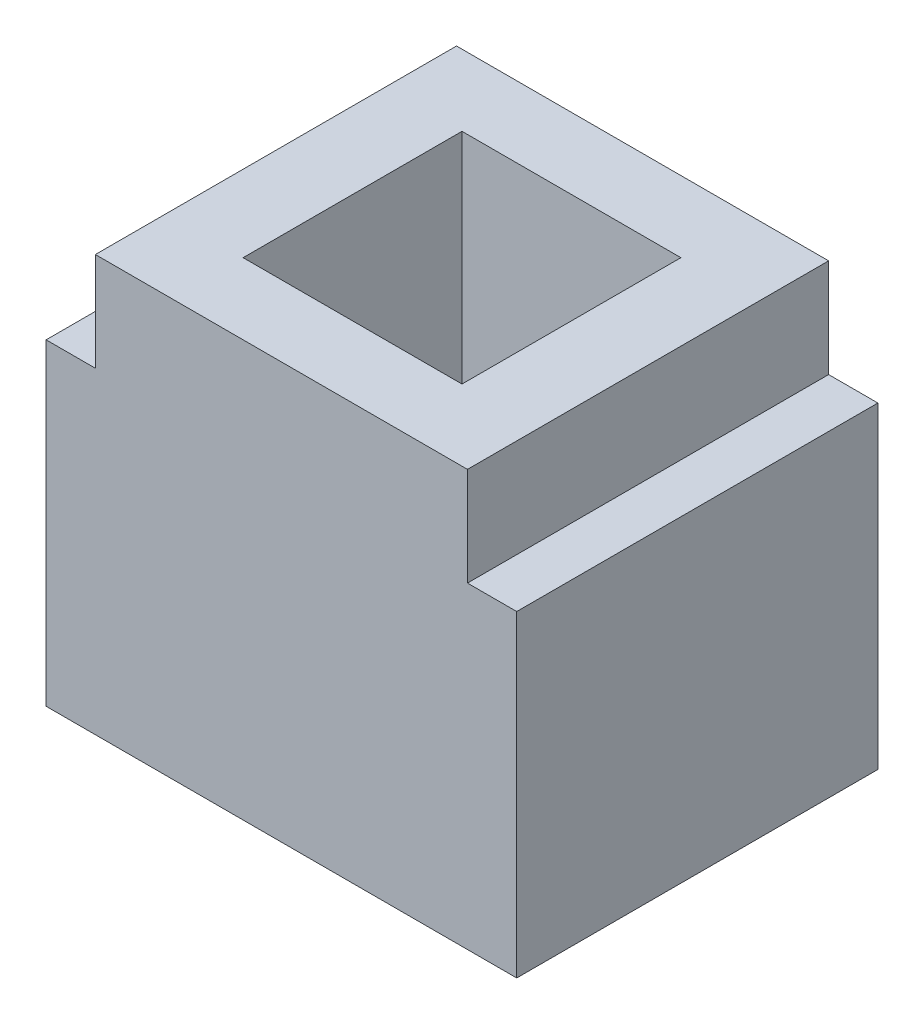
ISO-10303-21;
HEADER;
FILE_DESCRIPTION(('STEP AP214'),'2;1');
FILE_NAME('part.step','',(''),(''),'','','');
FILE_SCHEMA(('AUTOMOTIVE_DESIGN { 1 0 10303 214 1 1 1 1 }'));
ENDSEC;
DATA;
#1=APPLICATION_CONTEXT('core data for automotive mechanical design processes');
#2=APPLICATION_PROTOCOL_DEFINITION('international standard','automotive_design',2000,#1);
#3=PRODUCT_CONTEXT('',#1,'mechanical');
#4=PRODUCT('Part','Part','',(#3));
#5=PRODUCT_RELATED_PRODUCT_CATEGORY('part','',(#4));
#6=PRODUCT_DEFINITION_FORMATION('','',#4);
#7=PRODUCT_DEFINITION_CONTEXT('part definition',#1,'design');
#8=PRODUCT_DEFINITION('design','',#6,#7);
#9=PRODUCT_DEFINITION_SHAPE('','',#8);
#10=(LENGTH_UNIT() NAMED_UNIT(*) SI_UNIT(.MILLI.,.METRE.));
#11=(NAMED_UNIT(*) PLANE_ANGLE_UNIT() SI_UNIT($,.RADIAN.));
#12=(NAMED_UNIT(*) SI_UNIT($,.STERADIAN.) SOLID_ANGLE_UNIT());
#13=UNCERTAINTY_MEASURE_WITH_UNIT(LENGTH_MEASURE(1.E-05),#10,'distance_accuracy_value','');
#14=(GEOMETRIC_REPRESENTATION_CONTEXT(3) GLOBAL_UNCERTAINTY_ASSIGNED_CONTEXT((#13)) GLOBAL_UNIT_ASSIGNED_CONTEXT((#10,
#11,#12)) REPRESENTATION_CONTEXT('',''));
#15=CARTESIAN_POINT('',(0.,0.,0.));
#16=DIRECTION('',(0.,0.,1.));
#17=DIRECTION('',(1.,0.,0.));
#18=AXIS2_PLACEMENT_3D('',#15,#16,#17);
#19=CARTESIAN_POINT('',(43.,-29.,-66.));
#20=DIRECTION('',(1.,0.,0.));
#21=DIRECTION('',(0.,0.,-1.));
#22=AXIS2_PLACEMENT_3D('',#19,#20,#21);
#23=PLANE('',#22);
#24=DIRECTION('',(0.,1.,0.));
#25=VECTOR('',#24,1.);
#26=CARTESIAN_POINT('',(43.,-29.,0.));
#27=LINE('',#26,#25);
#28=CARTESIAN_POINT('',(43.,-29.,0.));
#29=VERTEX_POINT('',#28);
#30=CARTESIAN_POINT('',(43.,29.,0.));
#31=VERTEX_POINT('',#30);
#32=EDGE_CURVE('E149',#29,#31,#27,.T.);
#33=ORIENTED_EDGE('',*,*,#32,.F.);
#34=DIRECTION('',(0.,0.,1.));
#35=VECTOR('',#34,1.);
#36=CARTESIAN_POINT('',(43.,-29.,-66.));
#37=LINE('',#36,#35);
#38=CARTESIAN_POINT('',(43.,-29.,-66.));
#39=VERTEX_POINT('',#38);
#40=EDGE_CURVE('E11',#39,#29,#37,.T.);
#41=ORIENTED_EDGE('',*,*,#40,.F.);
#42=DIRECTION('',(0.,1.,0.));
#43=VECTOR('',#42,1.);
#44=CARTESIAN_POINT('',(43.,-29.,-66.));
#45=LINE('',#44,#43);
#46=CARTESIAN_POINT('',(43.,29.,-66.));
#47=VERTEX_POINT('',#46);
#48=EDGE_CURVE('E170',#39,#47,#45,.T.);
#49=ORIENTED_EDGE('',*,*,#48,.T.);
#50=DIRECTION('',(0.,0.,1.));
#51=VECTOR('',#50,1.);
#52=CARTESIAN_POINT('',(43.,29.,-66.));
#53=LINE('',#52,#51);
#54=EDGE_CURVE('E42',#47,#31,#53,.T.);
#55=ORIENTED_EDGE('',*,*,#54,.T.);
#56=EDGE_LOOP('',(#33,#41,#49,#55));
#57=FACE_BOUND('',#56,.T.);
#58=ADVANCED_FACE('F39',(#57),#23,.T.);
#59=CARTESIAN_POINT('',(-43.,-29.,-66.));
#60=DIRECTION('',(0.,-1.,0.));
#61=DIRECTION('',(0.,0.,-1.));
#62=AXIS2_PLACEMENT_3D('',#59,#60,#61);
#63=PLANE('',#62);
#64=DIRECTION('',(1.,0.,0.));
#65=VECTOR('',#64,1.);
#66=CARTESIAN_POINT('',(-43.,-29.,0.));
#67=LINE('',#66,#65);
#68=CARTESIAN_POINT('',(-43.,-29.,0.));
#69=VERTEX_POINT('',#68);
#70=EDGE_CURVE('E168',#69,#29,#67,.T.);
#71=ORIENTED_EDGE('',*,*,#70,.F.);
#72=DIRECTION('',(0.,0.,1.));
#73=VECTOR('',#72,1.);
#74=CARTESIAN_POINT('',(-43.,-29.,-66.));
#75=LINE('',#74,#73);
#76=CARTESIAN_POINT('',(-43.,-29.,-66.));
#77=VERTEX_POINT('',#76);
#78=EDGE_CURVE('E47',#77,#69,#75,.T.);
#79=ORIENTED_EDGE('',*,*,#78,.F.);
#80=DIRECTION('',(1.,0.,0.));
#81=VECTOR('',#80,1.);
#82=CARTESIAN_POINT('',(-43.,-29.,-66.));
#83=LINE('',#82,#81);
#84=EDGE_CURVE('E139',#77,#39,#83,.T.);
#85=ORIENTED_EDGE('',*,*,#84,.T.);
#86=ORIENTED_EDGE('',*,*,#40,.T.);
#87=EDGE_LOOP('',(#71,#79,#85,#86));
#88=FACE_BOUND('',#87,.T.);
#89=ADVANCED_FACE('F182',(#88),#63,.T.);
#90=CARTESIAN_POINT('',(-43.,29.,-66.));
#91=DIRECTION('',(-1.,0.,0.));
#92=DIRECTION('',(0.,0.,1.));
#93=AXIS2_PLACEMENT_3D('',#90,#91,#92);
#94=PLANE('',#93);
#95=DIRECTION('',(0.,-1.,0.));
#96=VECTOR('',#95,1.);
#97=CARTESIAN_POINT('',(-43.,29.,0.));
#98=LINE('',#97,#96);
#99=CARTESIAN_POINT('',(-43.,29.,0.));
#100=VERTEX_POINT('',#99);
#101=EDGE_CURVE('E126',#100,#69,#98,.T.);
#102=ORIENTED_EDGE('',*,*,#101,.F.);
#103=DIRECTION('',(0.,0.,1.));
#104=VECTOR('',#103,1.);
#105=CARTESIAN_POINT('',(-43.,29.,-66.));
#106=LINE('',#105,#104);
#107=CARTESIAN_POINT('',(-43.,29.,-66.));
#108=VERTEX_POINT('',#107);
#109=EDGE_CURVE('E120',#108,#100,#106,.T.);
#110=ORIENTED_EDGE('',*,*,#109,.F.);
#111=DIRECTION('',(0.,-1.,0.));
#112=VECTOR('',#111,1.);
#113=CARTESIAN_POINT('',(-43.,29.,-66.));
#114=LINE('',#113,#112);
#115=EDGE_CURVE('E123',#108,#77,#114,.T.);
#116=ORIENTED_EDGE('',*,*,#115,.T.);
#117=ORIENTED_EDGE('',*,*,#78,.T.);
#118=EDGE_LOOP('',(#102,#110,#116,#117));
#119=FACE_BOUND('',#118,.T.);
#120=ADVANCED_FACE('F122',(#119),#94,.T.);
#121=CARTESIAN_POINT('',(-34.,29.,-66.));
#122=DIRECTION('',(0.,1.,0.));
#123=DIRECTION('',(-1.,0.,0.));
#124=AXIS2_PLACEMENT_3D('',#121,#122,#123);
#125=PLANE('',#124);
#126=DIRECTION('',(-1.,0.,0.));
#127=VECTOR('',#126,1.);
#128=CARTESIAN_POINT('',(-34.,29.,0.));
#129=LINE('',#128,#127);
#130=CARTESIAN_POINT('',(-34.,29.,0.));
#131=VERTEX_POINT('',#130);
#132=EDGE_CURVE('E165',#131,#100,#129,.T.);
#133=ORIENTED_EDGE('',*,*,#132,.F.);
#134=DIRECTION('',(0.,0.,1.));
#135=VECTOR('',#134,1.);
#136=CARTESIAN_POINT('',(-34.,29.,-66.));
#137=LINE('',#136,#135);
#138=CARTESIAN_POINT('',(-34.,29.,-66.));
#139=VERTEX_POINT('',#138);
#140=EDGE_CURVE('E131',#139,#131,#137,.T.);
#141=ORIENTED_EDGE('',*,*,#140,.F.);
#142=DIRECTION('',(-1.,0.,0.));
#143=VECTOR('',#142,1.);
#144=CARTESIAN_POINT('',(-34.,29.,-66.));
#145=LINE('',#144,#143);
#146=EDGE_CURVE('E137',#139,#108,#145,.T.);
#147=ORIENTED_EDGE('',*,*,#146,.T.);
#148=ORIENTED_EDGE('',*,*,#109,.T.);
#149=EDGE_LOOP('',(#133,#141,#147,#148));
#150=FACE_BOUND('',#149,.T.);
#151=ADVANCED_FACE('F141',(#150),#125,.T.);
#152=CARTESIAN_POINT('',(-34.,47.,-66.));
#153=DIRECTION('',(-1.,0.,0.));
#154=DIRECTION('',(0.,0.,1.));
#155=AXIS2_PLACEMENT_3D('',#152,#153,#154);
#156=PLANE('',#155);
#157=DIRECTION('',(0.,-1.,0.));
#158=VECTOR('',#157,1.);
#159=CARTESIAN_POINT('',(-34.,47.,0.));
#160=LINE('',#159,#158);
#161=CARTESIAN_POINT('',(-34.,47.,0.));
#162=VERTEX_POINT('',#161);
#163=EDGE_CURVE('E162',#162,#131,#160,.T.);
#164=ORIENTED_EDGE('',*,*,#163,.F.);
#165=DIRECTION('',(0.,0.,1.));
#166=VECTOR('',#165,1.);
#167=CARTESIAN_POINT('',(-34.,47.,-66.));
#168=LINE('',#167,#166);
#169=CARTESIAN_POINT('',(-34.,47.,-66.));
#170=VERTEX_POINT('',#169);
#171=EDGE_CURVE('E174',#170,#162,#168,.T.);
#172=ORIENTED_EDGE('',*,*,#171,.F.);
#173=DIRECTION('',(0.,-1.,0.));
#174=VECTOR('',#173,1.);
#175=CARTESIAN_POINT('',(-34.,47.,-66.));
#176=LINE('',#175,#174);
#177=EDGE_CURVE('E142',#170,#139,#176,.T.);
#178=ORIENTED_EDGE('',*,*,#177,.T.);
#179=ORIENTED_EDGE('',*,*,#140,.T.);
#180=EDGE_LOOP('',(#164,#172,#178,#179));
#181=FACE_BOUND('',#180,.T.);
#182=ADVANCED_FACE('F195',(#181),#156,.T.);
#183=CARTESIAN_POINT('',(34.,47.,-66.));
#184=DIRECTION('',(0.,1.,0.));
#185=DIRECTION('',(0.,0.,1.));
#186=AXIS2_PLACEMENT_3D('',#183,#184,#185);
#187=PLANE('',#186);
#188=DIRECTION('',(0.,0.,1.));
#189=VECTOR('',#188,1.);
#190=CARTESIAN_POINT('',(-20.,47.,-53.));
#191=LINE('',#190,#189);
#192=CARTESIAN_POINT('',(-20.,47.,-53.));
#193=VERTEX_POINT('',#192);
#194=CARTESIAN_POINT('',(-20.,47.,-13.));
#195=VERTEX_POINT('',#194);
#196=EDGE_CURVE('E55',#193,#195,#191,.T.);
#197=ORIENTED_EDGE('',*,*,#196,.F.);
#198=DIRECTION('',(-1.,0.,0.));
#199=VECTOR('',#198,1.);
#200=CARTESIAN_POINT('',(-20.,47.,-53.));
#201=LINE('',#200,#199);
#202=CARTESIAN_POINT('',(20.,47.,-53.));
#203=VERTEX_POINT('',#202);
#204=EDGE_CURVE('E247',#203,#193,#201,.T.);
#205=ORIENTED_EDGE('',*,*,#204,.F.);
#206=DIRECTION('',(0.,0.,-1.));
#207=VECTOR('',#206,1.);
#208=CARTESIAN_POINT('',(20.,47.,-53.));
#209=LINE('',#208,#207);
#210=CARTESIAN_POINT('',(20.,47.,-13.));
#211=VERTEX_POINT('',#210);
#212=EDGE_CURVE('E252',#211,#203,#209,.T.);
#213=ORIENTED_EDGE('',*,*,#212,.F.);
#214=DIRECTION('',(1.,0.,0.));
#215=VECTOR('',#214,1.);
#216=CARTESIAN_POINT('',(-20.,47.,-13.));
#217=LINE('',#216,#215);
#218=EDGE_CURVE('E259',#195,#211,#217,.T.);
#219=ORIENTED_EDGE('',*,*,#218,.F.);
#220=EDGE_LOOP('',(#197,#205,#213,#219));
#221=FACE_BOUND('',#220,.T.);
#222=DIRECTION('',(-1.,0.,0.));
#223=VECTOR('',#222,1.);
#224=CARTESIAN_POINT('',(34.,47.,0.));
#225=LINE('',#224,#223);
#226=CARTESIAN_POINT('',(34.,47.,0.));
#227=VERTEX_POINT('',#226);
#228=EDGE_CURVE('E159',#227,#162,#225,.T.);
#229=ORIENTED_EDGE('',*,*,#228,.F.);
#230=DIRECTION('',(0.,0.,1.));
#231=VECTOR('',#230,1.);
#232=CARTESIAN_POINT('',(34.,47.,-66.));
#233=LINE('',#232,#231);
#234=CARTESIAN_POINT('',(34.,47.,-66.));
#235=VERTEX_POINT('',#234);
#236=EDGE_CURVE('E176',#235,#227,#233,.T.);
#237=ORIENTED_EDGE('',*,*,#236,.F.);
#238=DIRECTION('',(-1.,0.,0.));
#239=VECTOR('',#238,1.);
#240=CARTESIAN_POINT('',(34.,47.,-66.));
#241=LINE('',#240,#239);
#242=EDGE_CURVE('E144',#235,#170,#241,.T.);
#243=ORIENTED_EDGE('',*,*,#242,.T.);
#244=ORIENTED_EDGE('',*,*,#171,.T.);
#245=EDGE_LOOP('',(#229,#237,#243,#244));
#246=FACE_BOUND('',#245,.T.);
#247=ADVANCED_FACE('F198',(#221,#246),#187,.T.);
#248=CARTESIAN_POINT('',(34.,29.,-66.));
#249=DIRECTION('',(1.,0.,0.));
#250=DIRECTION('',(0.,0.,-1.));
#251=AXIS2_PLACEMENT_3D('',#248,#249,#250);
#252=PLANE('',#251);
#253=DIRECTION('',(0.,1.,0.));
#254=VECTOR('',#253,1.);
#255=CARTESIAN_POINT('',(34.,29.,0.));
#256=LINE('',#255,#254);
#257=CARTESIAN_POINT('',(34.,29.,0.));
#258=VERTEX_POINT('',#257);
#259=EDGE_CURVE('E156',#258,#227,#256,.T.);
#260=ORIENTED_EDGE('',*,*,#259,.F.);
#261=DIRECTION('',(0.,0.,1.));
#262=VECTOR('',#261,1.);
#263=CARTESIAN_POINT('',(34.,29.,-66.));
#264=LINE('',#263,#262);
#265=CARTESIAN_POINT('',(34.,29.,-66.));
#266=VERTEX_POINT('',#265);
#267=EDGE_CURVE('E177',#266,#258,#264,.T.);
#268=ORIENTED_EDGE('',*,*,#267,.F.);
#269=DIRECTION('',(0.,1.,0.));
#270=VECTOR('',#269,1.);
#271=CARTESIAN_POINT('',(34.,29.,-66.));
#272=LINE('',#271,#270);
#273=EDGE_CURVE('E275',#266,#235,#272,.T.);
#274=ORIENTED_EDGE('',*,*,#273,.T.);
#275=ORIENTED_EDGE('',*,*,#236,.T.);
#276=EDGE_LOOP('',(#260,#268,#274,#275));
#277=FACE_BOUND('',#276,.T.);
#278=ADVANCED_FACE('F202',(#277),#252,.T.);
#279=CARTESIAN_POINT('',(43.,29.,-66.));
#280=DIRECTION('',(0.,1.,0.));
#281=DIRECTION('',(-1.,0.,0.));
#282=AXIS2_PLACEMENT_3D('',#279,#280,#281);
#283=PLANE('',#282);
#284=DIRECTION('',(-1.,0.,0.));
#285=VECTOR('',#284,1.);
#286=CARTESIAN_POINT('',(43.,29.,0.));
#287=LINE('',#286,#285);
#288=EDGE_CURVE('E152',#31,#258,#287,.T.);
#289=ORIENTED_EDGE('',*,*,#288,.F.);
#290=ORIENTED_EDGE('',*,*,#54,.F.);
#291=DIRECTION('',(-1.,0.,0.));
#292=VECTOR('',#291,1.);
#293=CARTESIAN_POINT('',(43.,29.,-66.));
#294=LINE('',#293,#292);
#295=EDGE_CURVE('E273',#47,#266,#294,.T.);
#296=ORIENTED_EDGE('',*,*,#295,.T.);
#297=ORIENTED_EDGE('',*,*,#267,.T.);
#298=EDGE_LOOP('',(#289,#290,#296,#297));
#299=FACE_BOUND('',#298,.T.);
#300=ADVANCED_FACE('F179',(#299),#283,.T.);
#301=CARTESIAN_POINT('',(0.,0.,-66.));
#302=DIRECTION('',(0.,0.,1.));
#303=DIRECTION('',(1.,0.,0.));
#304=AXIS2_PLACEMENT_3D('',#301,#302,#303);
#305=PLANE('',#304);
#306=ORIENTED_EDGE('',*,*,#48,.F.);
#307=ORIENTED_EDGE('',*,*,#84,.F.);
#308=ORIENTED_EDGE('',*,*,#115,.F.);
#309=ORIENTED_EDGE('',*,*,#146,.F.);
#310=ORIENTED_EDGE('',*,*,#177,.F.);
#311=ORIENTED_EDGE('',*,*,#242,.F.);
#312=ORIENTED_EDGE('',*,*,#273,.F.);
#313=ORIENTED_EDGE('',*,*,#295,.F.);
#314=EDGE_LOOP('',(#306,#307,#308,#309,#310,#311,#312,#313));
#315=FACE_BOUND('',#314,.T.);
#316=ADVANCED_FACE('F135',(#315),#305,.F.);
#317=CARTESIAN_POINT('',(0.,0.,0.));
#318=DIRECTION('',(0.,0.,1.));
#319=DIRECTION('',(1.,0.,0.));
#320=AXIS2_PLACEMENT_3D('',#317,#318,#319);
#321=PLANE('',#320);
#322=ORIENTED_EDGE('',*,*,#32,.T.);
#323=ORIENTED_EDGE('',*,*,#288,.T.);
#324=ORIENTED_EDGE('',*,*,#259,.T.);
#325=ORIENTED_EDGE('',*,*,#228,.T.);
#326=ORIENTED_EDGE('',*,*,#163,.T.);
#327=ORIENTED_EDGE('',*,*,#132,.T.);
#328=ORIENTED_EDGE('',*,*,#101,.T.);
#329=ORIENTED_EDGE('',*,*,#70,.T.);
#330=EDGE_LOOP('',(#322,#323,#324,#325,#326,#327,#328,#329));
#331=FACE_BOUND('',#330,.T.);
#332=ADVANCED_FACE('F181',(#331),#321,.T.);
#333=CARTESIAN_POINT('',(-20.,-3.00000000000001,-53.));
#334=DIRECTION('',(-1.,0.,0.));
#335=DIRECTION('',(0.,0.,1.));
#336=AXIS2_PLACEMENT_3D('',#333,#334,#335);
#337=PLANE('',#336);
#338=ORIENTED_EDGE('',*,*,#196,.T.);
#339=DIRECTION('',(0.,1.,0.));
#340=VECTOR('',#339,1.);
#341=CARTESIAN_POINT('',(-20.,-3.00000000000001,-13.));
#342=LINE('',#341,#340);
#343=CARTESIAN_POINT('',(-20.,-3.00000000000001,-13.));
#344=VERTEX_POINT('',#343);
#345=EDGE_CURVE('E257',#344,#195,#342,.T.);
#346=ORIENTED_EDGE('',*,*,#345,.F.);
#347=DIRECTION('',(0.,0.,1.));
#348=VECTOR('',#347,1.);
#349=CARTESIAN_POINT('',(-20.,-3.00000000000001,-53.));
#350=LINE('',#349,#348);
#351=CARTESIAN_POINT('',(-20.,-3.00000000000001,-53.));
#352=VERTEX_POINT('',#351);
#353=EDGE_CURVE('E239',#352,#344,#350,.T.);
#354=ORIENTED_EDGE('',*,*,#353,.F.);
#355=DIRECTION('',(0.,1.,0.));
#356=VECTOR('',#355,1.);
#357=CARTESIAN_POINT('',(-20.,-3.00000000000001,-53.));
#358=LINE('',#357,#356);
#359=EDGE_CURVE('E153',#352,#193,#358,.T.);
#360=ORIENTED_EDGE('',*,*,#359,.T.);
#361=EDGE_LOOP('',(#338,#346,#354,#360));
#362=FACE_BOUND('',#361,.T.);
#363=ADVANCED_FACE('F213',(#362),#337,.F.);
#364=CARTESIAN_POINT('',(-20.,-3.00000000000001,-53.));
#365=DIRECTION('',(0.,0.,-1.));
#366=DIRECTION('',(-1.,0.,0.));
#367=AXIS2_PLACEMENT_3D('',#364,#365,#366);
#368=PLANE('',#367);
#369=ORIENTED_EDGE('',*,*,#204,.T.);
#370=ORIENTED_EDGE('',*,*,#359,.F.);
#371=DIRECTION('',(-1.,0.,0.));
#372=VECTOR('',#371,1.);
#373=CARTESIAN_POINT('',(-20.,-3.00000000000001,-53.));
#374=LINE('',#373,#372);
#375=CARTESIAN_POINT('',(20.,-3.00000000000001,-53.));
#376=VERTEX_POINT('',#375);
#377=EDGE_CURVE('E245',#376,#352,#374,.T.);
#378=ORIENTED_EDGE('',*,*,#377,.F.);
#379=DIRECTION('',(0.,1.,0.));
#380=VECTOR('',#379,1.);
#381=CARTESIAN_POINT('',(20.,-3.00000000000001,-53.));
#382=LINE('',#381,#380);
#383=EDGE_CURVE('E265',#376,#203,#382,.T.);
#384=ORIENTED_EDGE('',*,*,#383,.T.);
#385=EDGE_LOOP('',(#369,#370,#378,#384));
#386=FACE_BOUND('',#385,.T.);
#387=ADVANCED_FACE('F217',(#386),#368,.F.);
#388=CARTESIAN_POINT('',(20.,-3.00000000000001,-53.));
#389=DIRECTION('',(1.,0.,0.));
#390=DIRECTION('',(0.,0.,-1.));
#391=AXIS2_PLACEMENT_3D('',#388,#389,#390);
#392=PLANE('',#391);
#393=ORIENTED_EDGE('',*,*,#212,.T.);
#394=ORIENTED_EDGE('',*,*,#383,.F.);
#395=DIRECTION('',(0.,0.,-1.));
#396=VECTOR('',#395,1.);
#397=CARTESIAN_POINT('',(20.,-3.00000000000001,-53.));
#398=LINE('',#397,#396);
#399=CARTESIAN_POINT('',(20.,-3.00000000000001,-13.));
#400=VERTEX_POINT('',#399);
#401=EDGE_CURVE('E249',#400,#376,#398,.T.);
#402=ORIENTED_EDGE('',*,*,#401,.F.);
#403=DIRECTION('',(0.,1.,0.));
#404=VECTOR('',#403,1.);
#405=CARTESIAN_POINT('',(20.,-3.00000000000001,-13.));
#406=LINE('',#405,#404);
#407=EDGE_CURVE('E268',#400,#211,#406,.T.);
#408=ORIENTED_EDGE('',*,*,#407,.T.);
#409=EDGE_LOOP('',(#393,#394,#402,#408));
#410=FACE_BOUND('',#409,.T.);
#411=ADVANCED_FACE('F222',(#410),#392,.F.);
#412=CARTESIAN_POINT('',(-20.,-3.00000000000001,-13.));
#413=DIRECTION('',(0.,0.,1.));
#414=DIRECTION('',(1.,0.,0.));
#415=AXIS2_PLACEMENT_3D('',#412,#413,#414);
#416=PLANE('',#415);
#417=ORIENTED_EDGE('',*,*,#218,.T.);
#418=ORIENTED_EDGE('',*,*,#407,.F.);
#419=DIRECTION('',(1.,0.,0.));
#420=VECTOR('',#419,1.);
#421=CARTESIAN_POINT('',(-20.,-3.00000000000001,-13.));
#422=LINE('',#421,#420);
#423=EDGE_CURVE('E243',#344,#400,#422,.T.);
#424=ORIENTED_EDGE('',*,*,#423,.F.);
#425=ORIENTED_EDGE('',*,*,#345,.T.);
#426=EDGE_LOOP('',(#417,#418,#424,#425));
#427=FACE_BOUND('',#426,.T.);
#428=ADVANCED_FACE('F218',(#427),#416,.F.);
#429=CARTESIAN_POINT('',(0.,-3.00000000000001,0.));
#430=DIRECTION('',(0.,1.,0.));
#431=DIRECTION('',(0.,0.,1.));
#432=AXIS2_PLACEMENT_3D('',#429,#430,#431);
#433=PLANE('',#432);
#434=ORIENTED_EDGE('',*,*,#353,.T.);
#435=ORIENTED_EDGE('',*,*,#423,.T.);
#436=ORIENTED_EDGE('',*,*,#401,.T.);
#437=ORIENTED_EDGE('',*,*,#377,.T.);
#438=EDGE_LOOP('',(#434,#435,#436,#437));
#439=FACE_BOUND('',#438,.T.);
#440=ADVANCED_FACE('F221',(#439),#433,.T.);
#441=CLOSED_SHELL('',(#58,#89,#120,#151,#182,#247,#278,#300,#316,#332,#363,#387,#411,#428,#440));
#442=MANIFOLD_SOLID_BREP('B2',#441);
#443=ADVANCED_BREP_SHAPE_REPRESENTATION('',(#18,#442),#14);
#444=SHAPE_DEFINITION_REPRESENTATION(#9,#443);
ENDSEC;
END-ISO-10303-21;
